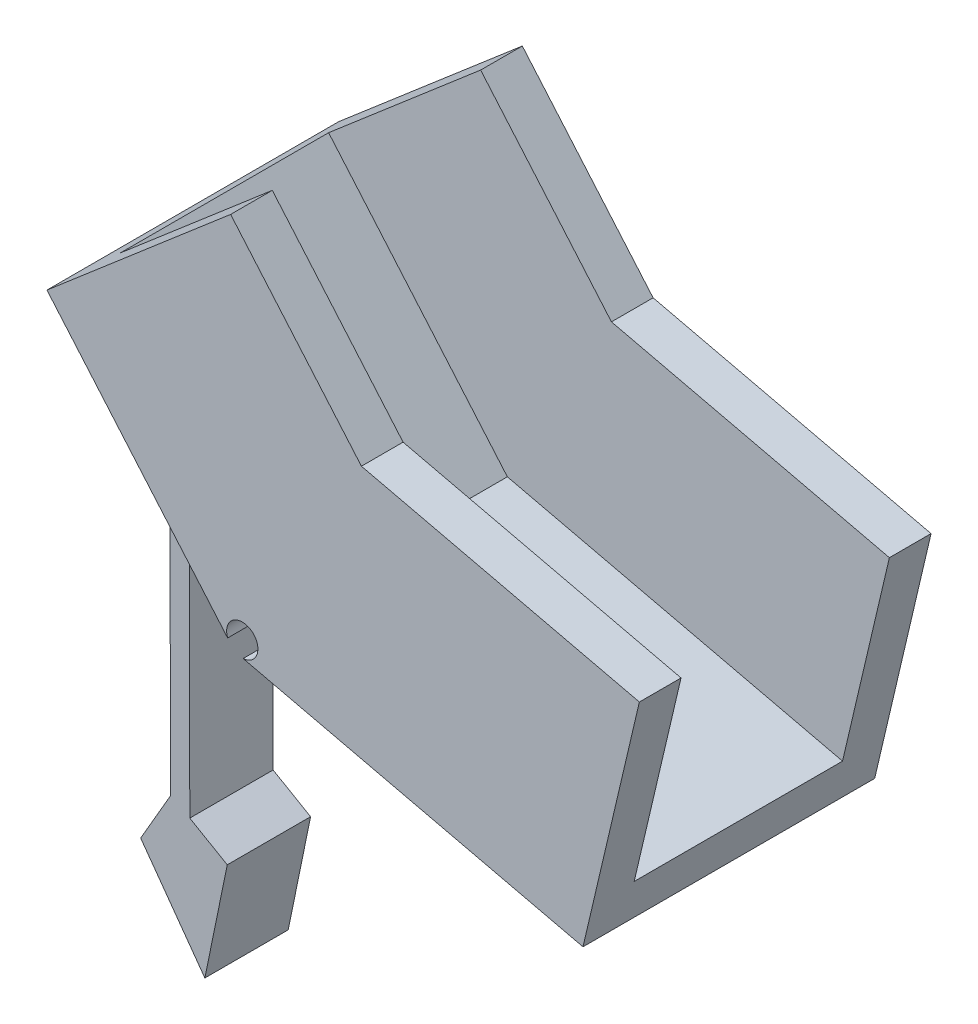
ISO-10303-21;
HEADER;
FILE_DESCRIPTION(('STEP AP214'),'2;1');
FILE_NAME('part.step','',(''),(''),'','','');
FILE_SCHEMA(('AUTOMOTIVE_DESIGN { 1 0 10303 214 1 1 1 1 }'));
ENDSEC;
DATA;
#1=APPLICATION_CONTEXT('core data for automotive mechanical design processes');
#2=APPLICATION_PROTOCOL_DEFINITION('international standard','automotive_design',2000,#1);
#3=PRODUCT_CONTEXT('',#1,'mechanical');
#4=PRODUCT('Part','Part','',(#3));
#5=PRODUCT_RELATED_PRODUCT_CATEGORY('part','',(#4));
#6=PRODUCT_DEFINITION_FORMATION('','',#4);
#7=PRODUCT_DEFINITION_CONTEXT('part definition',#1,'design');
#8=PRODUCT_DEFINITION('design','',#6,#7);
#9=PRODUCT_DEFINITION_SHAPE('','',#8);
#10=(LENGTH_UNIT() NAMED_UNIT(*) SI_UNIT(.MILLI.,.METRE.));
#11=(NAMED_UNIT(*) PLANE_ANGLE_UNIT() SI_UNIT($,.RADIAN.));
#12=(NAMED_UNIT(*) SI_UNIT($,.STERADIAN.) SOLID_ANGLE_UNIT());
#13=UNCERTAINTY_MEASURE_WITH_UNIT(LENGTH_MEASURE(1.E-05),#10,'distance_accuracy_value','');
#14=(GEOMETRIC_REPRESENTATION_CONTEXT(3) GLOBAL_UNCERTAINTY_ASSIGNED_CONTEXT((#13)) GLOBAL_UNIT_ASSIGNED_CONTEXT((#10,
#11,#12)) REPRESENTATION_CONTEXT('',''));
#15=CARTESIAN_POINT('',(0.,0.,0.));
#16=DIRECTION('',(0.,0.,1.));
#17=DIRECTION('',(1.,0.,0.));
#18=AXIS2_PLACEMENT_3D('',#15,#16,#17);
#19=CARTESIAN_POINT('',(28.5153445282735,6.50402219657851,10.));
#20=DIRECTION('',(0.228478349628428,0.973548994016773,0.));
#21=DIRECTION('',(-0.973548994016773,0.228478349628428,0.));
#22=AXIS2_PLACEMENT_3D('',#19,#20,#21);
#23=PLANE('',#22);
#24=DIRECTION('',(0.973548994016773,-0.228478349628428,0.));
#25=VECTOR('',#24,1.);
#26=CARTESIAN_POINT('',(28.5153445282735,6.50402219657851,12.));
#27=LINE('',#26,#25);
#28=CARTESIAN_POINT('',(28.9264850967183,6.40753324828637,12.));
#29=VERTEX_POINT('',#28);
#30=CARTESIAN_POINT('',(45.2385086558426,2.57932917761937,12.));
#31=VERTEX_POINT('',#30);
#32=EDGE_CURVE('E254',#29,#31,#27,.T.);
#33=ORIENTED_EDGE('',*,*,#32,.F.);
#34=DIRECTION('',(0.,0.,1.));
#35=VECTOR('',#34,1.);
#36=CARTESIAN_POINT('',(28.9264850967183,6.40753324828637,-2.));
#37=LINE('',#36,#35);
#38=CARTESIAN_POINT('',(28.9264850967182,6.40753324828637,-2.));
#39=VERTEX_POINT('',#38);
#40=EDGE_CURVE('E213',#29,#39,#37,.F.);
#41=ORIENTED_EDGE('',*,*,#40,.T.);
#42=DIRECTION('',(-0.973548994016773,0.228478349628428,0.));
#43=VECTOR('',#42,1.);
#44=CARTESIAN_POINT('',(-16.4748185209096,17.06258500766,-2.));
#45=LINE('',#44,#43);
#46=CARTESIAN_POINT('',(45.2385086558427,2.57932917761936,-2.));
#47=VERTEX_POINT('',#46);
#48=EDGE_CURVE('E224',#47,#39,#45,.T.);
#49=ORIENTED_EDGE('',*,*,#48,.F.);
#50=DIRECTION('',(0.,0.,-1.));
#51=VECTOR('',#50,1.);
#52=CARTESIAN_POINT('',(45.2385086558426,2.57932917761937,10.));
#53=LINE('',#52,#51);
#54=EDGE_CURVE('E42',#31,#47,#53,.T.);
#55=ORIENTED_EDGE('',*,*,#54,.F.);
#56=EDGE_LOOP('',(#33,#41,#49,#55));
#57=FACE_BOUND('',#56,.T.);
#58=ADVANCED_FACE('F35',(#57),#23,.F.);
#59=CARTESIAN_POINT('',(45.6954653550995,4.52642716565291,10.));
#60=DIRECTION('',(0.973548994016773,-0.228478349628428,0.));
#61=DIRECTION('',(0.228478349628428,0.973548994016773,0.));
#62=AXIS2_PLACEMENT_3D('',#59,#60,#61);
#63=PLANE('',#62);
#64=ORIENTED_EDGE('',*,*,#54,.T.);
#65=DIRECTION('',(-0.228478349628428,-0.973548994016773,0.));
#66=VECTOR('',#65,1.);
#67=CARTESIAN_POINT('',(40.3864879840851,-18.0951892247596,-2.));
#68=LINE('',#67,#66);
#69=CARTESIAN_POINT('',(47.9443348754312,14.1088872226101,-2.));
#70=VERTEX_POINT('',#69);
#71=EDGE_CURVE('E220',#70,#47,#68,.T.);
#72=ORIENTED_EDGE('',*,*,#71,.F.);
#73=DIRECTION('',(0.,0.,1.));
#74=VECTOR('',#73,1.);
#75=CARTESIAN_POINT('',(47.9443348754312,14.1088872226101,-2.));
#76=LINE('',#75,#74);
#77=CARTESIAN_POINT('',(47.9443348754312,14.1088872226101,0.));
#78=VERTEX_POINT('',#77);
#79=EDGE_CURVE('E247',#70,#78,#76,.T.);
#80=ORIENTED_EDGE('',*,*,#79,.T.);
#81=DIRECTION('',(-0.228478349628428,-0.973548994016773,0.));
#82=VECTOR('',#81,1.);
#83=CARTESIAN_POINT('',(40.3864879840851,-18.0951892247596,0.));
#84=LINE('',#83,#82);
#85=CARTESIAN_POINT('',(45.6954653550995,4.52642716565291,0.));
#86=VERTEX_POINT('',#85);
#87=EDGE_CURVE('E236',#78,#86,#84,.T.);
#88=ORIENTED_EDGE('',*,*,#87,.T.);
#89=DIRECTION('',(0.,0.,-1.));
#90=VECTOR('',#89,1.);
#91=CARTESIAN_POINT('',(45.6954653550995,4.52642716565291,10.));
#92=LINE('',#91,#90);
#93=CARTESIAN_POINT('',(45.6954653550995,4.52642716565291,10.));
#94=VERTEX_POINT('',#93);
#95=EDGE_CURVE('E301',#94,#86,#92,.T.);
#96=ORIENTED_EDGE('',*,*,#95,.F.);
#97=DIRECTION('',(0.228478349628428,0.973548994016773,0.));
#98=VECTOR('',#97,1.);
#99=CARTESIAN_POINT('',(47.9443348754312,14.1088872226101,10.));
#100=LINE('',#99,#98);
#101=CARTESIAN_POINT('',(47.9443348754312,14.1088872226101,10.));
#102=VERTEX_POINT('',#101);
#103=EDGE_CURVE('E250',#94,#102,#100,.T.);
#104=ORIENTED_EDGE('',*,*,#103,.T.);
#105=DIRECTION('',(0.,0.,-1.));
#106=VECTOR('',#105,1.);
#107=CARTESIAN_POINT('',(47.9443348754312,14.1088872226101,12.));
#108=LINE('',#107,#106);
#109=CARTESIAN_POINT('',(47.9443348754312,14.1088872226101,12.));
#110=VERTEX_POINT('',#109);
#111=EDGE_CURVE('E279',#110,#102,#108,.T.);
#112=ORIENTED_EDGE('',*,*,#111,.F.);
#113=DIRECTION('',(0.228478349628428,0.973548994016773,0.));
#114=VECTOR('',#113,1.);
#115=CARTESIAN_POINT('',(47.9443348754312,14.1088872226101,12.));
#116=LINE('',#115,#114);
#117=EDGE_CURVE('E257',#31,#110,#116,.T.);
#118=ORIENTED_EDGE('',*,*,#117,.F.);
#119=EDGE_LOOP('',(#64,#72,#80,#88,#96,#104,#112,#118));
#120=FACE_BOUND('',#119,.T.);
#121=ADVANCED_FACE('F305',(#120),#63,.T.);
#122=CARTESIAN_POINT('',(28.9723012275304,8.45112018461206,10.));
#123=DIRECTION('',(0.228478349628428,0.973548994016773,0.));
#124=DIRECTION('',(-0.973548994016773,0.228478349628428,0.));
#125=AXIS2_PLACEMENT_3D('',#122,#123,#124);
#126=PLANE('',#125);
#127=DIRECTION('',(0.973548994016773,-0.228478349628428,0.));
#128=VECTOR('',#127,1.);
#129=CARTESIAN_POINT('',(28.9723012275304,8.45112018461206,0.));
#130=LINE('',#129,#128);
#131=CARTESIAN_POINT('',(29.6087891147529,8.30174536842424,0.));
#132=VERTEX_POINT('',#131);
#133=EDGE_CURVE('E282',#132,#86,#130,.T.);
#134=ORIENTED_EDGE('',*,*,#133,.F.);
#135=DIRECTION('',(0.,0.,-1.));
#136=VECTOR('',#135,1.);
#137=CARTESIAN_POINT('',(29.6087891147529,8.30174536842424,10.));
#138=LINE('',#137,#136);
#139=CARTESIAN_POINT('',(29.6087891147529,8.30174536842424,10.));
#140=VERTEX_POINT('',#139);
#141=EDGE_CURVE('E299',#140,#132,#138,.T.);
#142=ORIENTED_EDGE('',*,*,#141,.F.);
#143=DIRECTION('',(0.973548994016773,-0.228478349628428,0.));
#144=VECTOR('',#143,1.);
#145=CARTESIAN_POINT('',(28.9723012275304,8.45112018461206,10.));
#146=LINE('',#145,#144);
#147=EDGE_CURVE('E283',#140,#94,#146,.T.);
#148=ORIENTED_EDGE('',*,*,#147,.T.);
#149=ORIENTED_EDGE('',*,*,#95,.T.);
#150=EDGE_LOOP('',(#134,#142,#148,#149));
#151=FACE_BOUND('',#150,.T.);
#152=ADVANCED_FACE('F345',(#151),#126,.T.);
#153=CARTESIAN_POINT('',(21.029242867494,18.3157968982283,10.));
#154=DIRECTION('',(0.759403711879393,0.650619706421347,0.));
#155=DIRECTION('',(-0.650619706421347,0.759403711879393,0.));
#156=AXIS2_PLACEMENT_3D('',#153,#154,#155);
#157=PLANE('',#156);
#158=DIRECTION('',(0.650619706421347,-0.759403711879393,0.));
#159=VECTOR('',#158,1.);
#160=CARTESIAN_POINT('',(21.029242867494,18.3157968982283,0.));
#161=LINE('',#160,#159);
#162=CARTESIAN_POINT('',(21.029242867494,18.3157968982283,0.));
#163=VERTEX_POINT('',#162);
#164=EDGE_CURVE('E287',#163,#132,#161,.T.);
#165=ORIENTED_EDGE('',*,*,#164,.F.);
#166=DIRECTION('',(0.,0.,-1.));
#167=VECTOR('',#166,1.);
#168=CARTESIAN_POINT('',(21.029242867494,18.3157968982283,10.));
#169=LINE('',#168,#167);
#170=CARTESIAN_POINT('',(21.029242867494,18.3157968982283,10.));
#171=VERTEX_POINT('',#170);
#172=EDGE_CURVE('E297',#171,#163,#169,.T.);
#173=ORIENTED_EDGE('',*,*,#172,.F.);
#174=DIRECTION('',(0.650619706421347,-0.759403711879393,0.));
#175=VECTOR('',#174,1.);
#176=CARTESIAN_POINT('',(21.029242867494,18.3157968982283,10.));
#177=LINE('',#176,#175);
#178=EDGE_CURVE('E286',#171,#140,#177,.T.);
#179=ORIENTED_EDGE('',*,*,#178,.T.);
#180=ORIENTED_EDGE('',*,*,#141,.T.);
#181=EDGE_LOOP('',(#165,#173,#179,#180));
#182=FACE_BOUND('',#181,.T.);
#183=ADVANCED_FACE('F361',(#182),#157,.T.);
#184=CARTESIAN_POINT('',(19.5104354437352,17.0145574853856,10.));
#185=DIRECTION('',(-0.650619706421346,0.759403711879394,0.));
#186=DIRECTION('',(-0.759403711879394,-0.650619706421346,0.));
#187=AXIS2_PLACEMENT_3D('',#184,#185,#186);
#188=PLANE('',#187);
#189=ORIENTED_EDGE('',*,*,#172,.T.);
#190=DIRECTION('',(0.759403711879393,0.650619706421347,0.));
#191=VECTOR('',#190,1.);
#192=CARTESIAN_POINT('',(-14.2313746257409,-11.893763896396,0.));
#193=LINE('',#192,#191);
#194=CARTESIAN_POINT('',(28.3260550401262,24.5673462642705,0.));
#195=VERTEX_POINT('',#194);
#196=EDGE_CURVE('E239',#163,#195,#193,.T.);
#197=ORIENTED_EDGE('',*,*,#196,.T.);
#198=DIRECTION('',(0.,0.,1.));
#199=VECTOR('',#198,1.);
#200=CARTESIAN_POINT('',(28.3260550401262,24.5673462642705,-2.));
#201=LINE('',#200,#199);
#202=CARTESIAN_POINT('',(28.3260550401262,24.5673462642705,-2.));
#203=VERTEX_POINT('',#202);
#204=EDGE_CURVE('E244',#203,#195,#201,.T.);
#205=ORIENTED_EDGE('',*,*,#204,.F.);
#206=DIRECTION('',(0.759403711879393,0.650619706421347,0.));
#207=VECTOR('',#206,1.);
#208=CARTESIAN_POINT('',(-14.2313746257409,-11.893763896396,-2.));
#209=LINE('',#208,#207);
#210=CARTESIAN_POINT('',(19.5104354437352,17.0145574853856,-2.));
#211=VERTEX_POINT('',#210);
#212=EDGE_CURVE('E229',#211,#203,#209,.T.);
#213=ORIENTED_EDGE('',*,*,#212,.F.);
#214=DIRECTION('',(0.,0.,-1.));
#215=VECTOR('',#214,1.);
#216=CARTESIAN_POINT('',(19.5104354437352,17.0145574853856,10.));
#217=LINE('',#216,#215);
#218=CARTESIAN_POINT('',(19.5104354437352,17.0145574853856,12.));
#219=VERTEX_POINT('',#218);
#220=EDGE_CURVE('E290',#219,#211,#217,.T.);
#221=ORIENTED_EDGE('',*,*,#220,.F.);
#222=DIRECTION('',(-0.759403711879393,-0.650619706421347,0.));
#223=VECTOR('',#222,1.);
#224=CARTESIAN_POINT('',(19.5104354437352,17.0145574853856,12.));
#225=LINE('',#224,#223);
#226=CARTESIAN_POINT('',(28.3260550401262,24.5673462642705,12.));
#227=VERTEX_POINT('',#226);
#228=EDGE_CURVE('E263',#227,#219,#225,.T.);
#229=ORIENTED_EDGE('',*,*,#228,.F.);
#230=DIRECTION('',(0.,0.,-1.));
#231=VECTOR('',#230,1.);
#232=CARTESIAN_POINT('',(28.3260550401262,24.5673462642705,12.));
#233=LINE('',#232,#231);
#234=CARTESIAN_POINT('',(28.3260550401262,24.5673462642705,10.));
#235=VERTEX_POINT('',#234);
#236=EDGE_CURVE('E266',#227,#235,#233,.T.);
#237=ORIENTED_EDGE('',*,*,#236,.T.);
#238=DIRECTION('',(-0.759403711879393,-0.650619706421347,0.));
#239=VECTOR('',#238,1.);
#240=CARTESIAN_POINT('',(19.5104354437352,17.0145574853856,10.));
#241=LINE('',#240,#239);
#242=EDGE_CURVE('E255',#235,#171,#241,.T.);
#243=ORIENTED_EDGE('',*,*,#242,.T.);
#244=EDGE_LOOP('',(#189,#197,#205,#213,#221,#229,#237,#243));
#245=FACE_BOUND('',#244,.T.);
#246=ADVANCED_FACE('F330',(#245),#188,.T.);
#247=CARTESIAN_POINT('',(19.5104354437352,17.0145574853856,10.));
#248=DIRECTION('',(0.759403711879393,0.650619706421347,0.));
#249=DIRECTION('',(-0.650619706421347,0.759403711879393,0.));
#250=AXIS2_PLACEMENT_3D('',#247,#248,#249);
#251=PLANE('',#250);
#252=DIRECTION('',(0.,0.,-1.));
#253=VECTOR('',#252,1.);
#254=CARTESIAN_POINT('',(25.4476892611492,10.0845912657728,8.));
#255=LINE('',#254,#253);
#256=CARTESIAN_POINT('',(25.4476892611492,10.0845912657728,8.));
#257=VERTEX_POINT('',#256);
#258=CARTESIAN_POINT('',(25.4476892611492,10.0845912657728,4.));
#259=VERTEX_POINT('',#258);
#260=EDGE_CURVE('E54',#257,#259,#255,.T.);
#261=ORIENTED_EDGE('',*,*,#260,.F.);
#262=DIRECTION('',(0.650619706421347,-0.759403711879393,0.));
#263=VECTOR('',#262,1.);
#264=CARTESIAN_POINT('',(19.6581549589548,16.8421391785504,8.));
#265=LINE('',#264,#263);
#266=CARTESIAN_POINT('',(26.3792351296592,8.99729036887335,8.));
#267=VERTEX_POINT('',#266);
#268=EDGE_CURVE('E49',#257,#267,#265,.T.);
#269=ORIENTED_EDGE('',*,*,#268,.T.);
#270=DIRECTION('',(0.,0.,-1.));
#271=VECTOR('',#270,1.);
#272=CARTESIAN_POINT('',(26.3792351296592,8.99729036887336,8.));
#273=LINE('',#272,#271);
#274=CARTESIAN_POINT('',(26.3792351296592,8.99729036887336,4.));
#275=VERTEX_POINT('',#274);
#276=EDGE_CURVE('E188',#267,#275,#273,.T.);
#277=ORIENTED_EDGE('',*,*,#276,.T.);
#278=DIRECTION('',(0.650619706421347,-0.759403711879393,0.));
#279=VECTOR('',#278,1.);
#280=CARTESIAN_POINT('',(19.6581549589548,16.8421391785504,4.));
#281=LINE('',#280,#279);
#282=EDGE_CURVE('E607',#259,#275,#281,.T.);
#283=ORIENTED_EDGE('',*,*,#282,.F.);
#284=EDGE_LOOP('',(#261,#269,#277,#283));
#285=FACE_BOUND('',#284,.T.);
#286=DIRECTION('',(-0.650619706421347,0.759403711879393,0.));
#287=VECTOR('',#286,1.);
#288=CARTESIAN_POINT('',(12.414970876809,25.2963879870626,-2.));
#289=LINE('',#288,#287);
#290=CARTESIAN_POINT('',(28.1839273805532,6.89085249033582,-2.));
#291=VERTEX_POINT('',#290);
#292=EDGE_CURVE('E227',#291,#211,#289,.T.);
#293=ORIENTED_EDGE('',*,*,#292,.F.);
#294=DIRECTION('',(0.,0.,1.));
#295=VECTOR('',#294,1.);
#296=CARTESIAN_POINT('',(28.1839273805532,6.8908524903358,-2.));
#297=LINE('',#296,#295);
#298=CARTESIAN_POINT('',(28.1839273805532,6.89085249033581,12.));
#299=VERTEX_POINT('',#298);
#300=EDGE_CURVE('E206',#291,#299,#297,.T.);
#301=ORIENTED_EDGE('',*,*,#300,.T.);
#302=DIRECTION('',(0.650619706421347,-0.759403711879393,0.));
#303=VECTOR('',#302,1.);
#304=CARTESIAN_POINT('',(19.5104354437352,17.0145574853856,12.));
#305=LINE('',#304,#303);
#306=EDGE_CURVE('E251',#219,#299,#305,.T.);
#307=ORIENTED_EDGE('',*,*,#306,.F.);
#308=ORIENTED_EDGE('',*,*,#220,.T.);
#309=EDGE_LOOP('',(#293,#301,#307,#308));
#310=FACE_BOUND('',#309,.T.);
#311=ADVANCED_FACE('F324',(#285,#310),#251,.F.);
#312=CARTESIAN_POINT('',(34.6040511184167,17.2396654732269,12.));
#313=DIRECTION('',(-0.228478349628428,-0.973548994016773,0.));
#314=DIRECTION('',(0.973548994016773,-0.228478349628428,0.));
#315=AXIS2_PLACEMENT_3D('',#312,#313,#314);
#316=PLANE('',#315);
#317=DIRECTION('',(-0.973548994016772,0.228478349628428,0.));
#318=VECTOR('',#317,1.);
#319=CARTESIAN_POINT('',(34.6040511184167,17.2396654732269,10.));
#320=LINE('',#319,#318);
#321=CARTESIAN_POINT('',(34.6040511184167,17.2396654732269,10.));
#322=VERTEX_POINT('',#321);
#323=EDGE_CURVE('E268',#102,#322,#320,.T.);
#324=ORIENTED_EDGE('',*,*,#323,.T.);
#325=DIRECTION('',(0.,0.,-1.));
#326=VECTOR('',#325,1.);
#327=CARTESIAN_POINT('',(34.6040511184167,17.2396654732269,12.));
#328=LINE('',#327,#326);
#329=CARTESIAN_POINT('',(34.6040511184167,17.2396654732269,12.));
#330=VERTEX_POINT('',#329);
#331=EDGE_CURVE('E276',#330,#322,#328,.T.);
#332=ORIENTED_EDGE('',*,*,#331,.F.);
#333=DIRECTION('',(-0.973548994016772,0.228478349628428,0.));
#334=VECTOR('',#333,1.);
#335=CARTESIAN_POINT('',(34.6040511184167,17.2396654732269,12.));
#336=LINE('',#335,#334);
#337=EDGE_CURVE('E259',#110,#330,#336,.T.);
#338=ORIENTED_EDGE('',*,*,#337,.F.);
#339=ORIENTED_EDGE('',*,*,#111,.T.);
#340=EDGE_LOOP('',(#324,#332,#338,#339));
#341=FACE_BOUND('',#340,.T.);
#342=ADVANCED_FACE('F353',(#341),#316,.F.);
#343=CARTESIAN_POINT('',(28.3260550401262,24.5673462642705,12.));
#344=DIRECTION('',(-0.759403711879392,-0.650619706421348,0.));
#345=DIRECTION('',(0.650619706421348,-0.759403711879392,0.));
#346=AXIS2_PLACEMENT_3D('',#343,#344,#345);
#347=PLANE('',#346);
#348=DIRECTION('',(-0.650619706421348,0.759403711879392,0.));
#349=VECTOR('',#348,1.);
#350=CARTESIAN_POINT('',(28.3260550401262,24.5673462642705,10.));
#351=LINE('',#350,#349);
#352=EDGE_CURVE('E270',#322,#235,#351,.T.);
#353=ORIENTED_EDGE('',*,*,#352,.T.);
#354=ORIENTED_EDGE('',*,*,#236,.F.);
#355=DIRECTION('',(-0.650619706421348,0.759403711879392,0.));
#356=VECTOR('',#355,1.);
#357=CARTESIAN_POINT('',(28.3260550401262,24.5673462642705,12.));
#358=LINE('',#357,#356);
#359=EDGE_CURVE('E261',#330,#227,#358,.T.);
#360=ORIENTED_EDGE('',*,*,#359,.F.);
#361=ORIENTED_EDGE('',*,*,#331,.T.);
#362=EDGE_LOOP('',(#353,#354,#360,#361));
#363=FACE_BOUND('',#362,.T.);
#364=ADVANCED_FACE('F358',(#363),#347,.F.);
#365=CARTESIAN_POINT('',(0.,0.,12.));
#366=DIRECTION('',(0.,0.,1.));
#367=DIRECTION('',(1.,0.,0.));
#368=AXIS2_PLACEMENT_3D('',#365,#366,#367);
#369=PLANE('',#368);
#370=CARTESIAN_POINT('',(28.8853419881829,7.15640389440628,12.));
#371=DIRECTION('',(0.,0.,1.));
#372=DIRECTION('',(1.,0.,0.));
#373=AXIS2_PLACEMENT_3D('',#370,#371,#372);
#374=CIRCLE('',#373,0.749999999999998);
#375=EDGE_CURVE('E204',#29,#299,#374,.T.);
#376=ORIENTED_EDGE('',*,*,#375,.F.);
#377=ORIENTED_EDGE('',*,*,#32,.T.);
#378=ORIENTED_EDGE('',*,*,#117,.T.);
#379=ORIENTED_EDGE('',*,*,#337,.T.);
#380=ORIENTED_EDGE('',*,*,#359,.T.);
#381=ORIENTED_EDGE('',*,*,#228,.T.);
#382=ORIENTED_EDGE('',*,*,#306,.T.);
#383=EDGE_LOOP('',(#376,#377,#378,#379,#380,#381,#382));
#384=FACE_BOUND('',#383,.T.);
#385=ADVANCED_FACE('F319',(#384),#369,.T.);
#386=CARTESIAN_POINT('',(0.,0.,10.));
#387=DIRECTION('',(0.,0.,1.));
#388=DIRECTION('',(1.,0.,0.));
#389=AXIS2_PLACEMENT_3D('',#386,#387,#388);
#390=PLANE('',#389);
#391=ORIENTED_EDGE('',*,*,#147,.F.);
#392=ORIENTED_EDGE('',*,*,#178,.F.);
#393=ORIENTED_EDGE('',*,*,#242,.F.);
#394=ORIENTED_EDGE('',*,*,#352,.F.);
#395=ORIENTED_EDGE('',*,*,#323,.F.);
#396=ORIENTED_EDGE('',*,*,#103,.F.);
#397=EDGE_LOOP('',(#391,#392,#393,#394,#395,#396));
#398=FACE_BOUND('',#397,.T.);
#399=ADVANCED_FACE('F347',(#398),#390,.F.);
#400=CARTESIAN_POINT('',(0.,0.,0.));
#401=DIRECTION('',(0.,0.,-1.));
#402=DIRECTION('',(-1.,0.,0.));
#403=AXIS2_PLACEMENT_3D('',#400,#401,#402);
#404=PLANE('',#403);
#405=ORIENTED_EDGE('',*,*,#196,.F.);
#406=ORIENTED_EDGE('',*,*,#164,.T.);
#407=ORIENTED_EDGE('',*,*,#133,.T.);
#408=ORIENTED_EDGE('',*,*,#87,.F.);
#409=DIRECTION('',(0.973548994016773,-0.228478349628428,0.));
#410=VECTOR('',#409,1.);
#411=CARTESIAN_POINT('',(-13.768992301321,28.5921430526507,0.));
#412=LINE('',#411,#410);
#413=CARTESIAN_POINT('',(34.6040511184167,17.239665473227,0.));
#414=VERTEX_POINT('',#413);
#415=EDGE_CURVE('E216',#414,#78,#412,.T.);
#416=ORIENTED_EDGE('',*,*,#415,.F.);
#417=DIRECTION('',(0.650619706421348,-0.759403711879392,0.));
#418=VECTOR('',#417,1.);
#419=CARTESIAN_POINT('',(21.2305904731999,32.8491767659475,0.));
#420=LINE('',#419,#418);
#421=EDGE_CURVE('E221',#195,#414,#420,.T.);
#422=ORIENTED_EDGE('',*,*,#421,.F.);
#423=EDGE_LOOP('',(#405,#406,#407,#408,#416,#422));
#424=FACE_BOUND('',#423,.T.);
#425=ADVANCED_FACE('F340',(#424),#404,.F.);
#426=CARTESIAN_POINT('',(-13.768992301321,28.5921430526507,-2.));
#427=DIRECTION('',(-0.228478349628428,-0.973548994016773,0.));
#428=DIRECTION('',(0.973548994016773,-0.228478349628428,0.));
#429=AXIS2_PLACEMENT_3D('',#426,#427,#428);
#430=PLANE('',#429);
#431=ORIENTED_EDGE('',*,*,#415,.T.);
#432=ORIENTED_EDGE('',*,*,#79,.F.);
#433=DIRECTION('',(0.973548994016773,-0.228478349628428,0.));
#434=VECTOR('',#433,1.);
#435=CARTESIAN_POINT('',(-13.768992301321,28.5921430526507,-2.));
#436=LINE('',#435,#434);
#437=CARTESIAN_POINT('',(34.6040511184167,17.239665473227,-2.));
#438=VERTEX_POINT('',#437);
#439=EDGE_CURVE('E217',#438,#70,#436,.T.);
#440=ORIENTED_EDGE('',*,*,#439,.F.);
#441=DIRECTION('',(0.,0.,1.));
#442=VECTOR('',#441,1.);
#443=CARTESIAN_POINT('',(34.6040511184167,17.239665473227,-2.));
#444=LINE('',#443,#442);
#445=EDGE_CURVE('E233',#438,#414,#444,.T.);
#446=ORIENTED_EDGE('',*,*,#445,.T.);
#447=EDGE_LOOP('',(#431,#432,#440,#446));
#448=FACE_BOUND('',#447,.T.);
#449=ADVANCED_FACE('F337',(#448),#430,.F.);
#450=CARTESIAN_POINT('',(21.2305904731999,32.8491767659475,-2.));
#451=DIRECTION('',(-0.759403711879392,-0.650619706421348,0.));
#452=DIRECTION('',(0.650619706421348,-0.759403711879392,0.));
#453=AXIS2_PLACEMENT_3D('',#450,#451,#452);
#454=PLANE('',#453);
#455=ORIENTED_EDGE('',*,*,#421,.T.);
#456=ORIENTED_EDGE('',*,*,#445,.F.);
#457=DIRECTION('',(0.650619706421348,-0.759403711879392,0.));
#458=VECTOR('',#457,1.);
#459=CARTESIAN_POINT('',(21.2305904731999,32.8491767659475,-2.));
#460=LINE('',#459,#458);
#461=EDGE_CURVE('E231',#203,#438,#460,.T.);
#462=ORIENTED_EDGE('',*,*,#461,.F.);
#463=ORIENTED_EDGE('',*,*,#204,.T.);
#464=EDGE_LOOP('',(#455,#456,#462,#463));
#465=FACE_BOUND('',#464,.T.);
#466=ADVANCED_FACE('F334',(#465),#454,.F.);
#467=CARTESIAN_POINT('',(0.,0.,-2.));
#468=DIRECTION('',(0.,0.,-1.));
#469=DIRECTION('',(-1.,0.,0.));
#470=AXIS2_PLACEMENT_3D('',#467,#468,#469);
#471=PLANE('',#470);
#472=CARTESIAN_POINT('',(28.8853419881829,7.15640389440628,-2.));
#473=DIRECTION('',(0.,0.,-1.));
#474=DIRECTION('',(-1.,0.,0.));
#475=AXIS2_PLACEMENT_3D('',#472,#473,#474);
#476=CIRCLE('',#475,0.749999999999998);
#477=EDGE_CURVE('E11',#291,#39,#476,.T.);
#478=ORIENTED_EDGE('',*,*,#477,.F.);
#479=ORIENTED_EDGE('',*,*,#292,.T.);
#480=ORIENTED_EDGE('',*,*,#212,.T.);
#481=ORIENTED_EDGE('',*,*,#461,.T.);
#482=ORIENTED_EDGE('',*,*,#439,.T.);
#483=ORIENTED_EDGE('',*,*,#71,.T.);
#484=ORIENTED_EDGE('',*,*,#48,.T.);
#485=EDGE_LOOP('',(#478,#479,#480,#481,#482,#483,#484));
#486=FACE_BOUND('',#485,.T.);
#487=ADVANCED_FACE('F312',(#486),#471,.T.);
#488=CARTESIAN_POINT('',(28.8853419881829,7.15640389440628,-2.));
#489=DIRECTION('',(0.,0.,1.));
#490=DIRECTION('',(1.,0.,0.));
#491=AXIS2_PLACEMENT_3D('',#488,#489,#490);
#492=CYLINDRICAL_SURFACE('',#491,0.749999999999998);
#493=ORIENTED_EDGE('',*,*,#375,.T.);
#494=ORIENTED_EDGE('',*,*,#300,.F.);
#495=ORIENTED_EDGE('',*,*,#477,.T.);
#496=ORIENTED_EDGE('',*,*,#40,.F.);
#497=EDGE_LOOP('',(#493,#494,#495,#496));
#498=FACE_BOUND('',#497,.T.);
#499=ADVANCED_FACE('F317',(#498),#492,.F.);
#500=CARTESIAN_POINT('',(22.3602788674752,0.0218340202512122,8.));
#501=DIRECTION('',(-0.999999523258806,-0.00097646411171529,0.));
#502=DIRECTION('',(0.00097646411171529,-0.999999523258806,0.));
#503=AXIS2_PLACEMENT_3D('',#500,#501,#502);
#504=PLANE('',#503);
#505=DIRECTION('',(-0.00097646411171529,0.999999523258806,0.));
#506=VECTOR('',#505,1.);
#507=CARTESIAN_POINT('',(22.3602788674752,0.0218340202512122,4.));
#508=LINE('',#507,#506);
#509=CARTESIAN_POINT('',(22.3656768053961,-5.50620872373804,4.));
#510=VERTEX_POINT('',#509);
#511=CARTESIAN_POINT('',(22.3548813733866,5.54942223433152,4.));
#512=VERTEX_POINT('',#511);
#513=EDGE_CURVE('E203',#510,#512,#508,.T.);
#514=ORIENTED_EDGE('',*,*,#513,.T.);
#515=DIRECTION('',(0.,0.,-1.));
#516=VECTOR('',#515,1.);
#517=CARTESIAN_POINT('',(22.3548813733866,5.54942223433152,8.));
#518=LINE('',#517,#516);
#519=CARTESIAN_POINT('',(22.3548813733866,5.54942223433152,8.));
#520=VERTEX_POINT('',#519);
#521=EDGE_CURVE('E186',#520,#512,#518,.T.);
#522=ORIENTED_EDGE('',*,*,#521,.F.);
#523=DIRECTION('',(-0.00097646411171529,0.999999523258806,0.));
#524=VECTOR('',#523,1.);
#525=CARTESIAN_POINT('',(22.3602788674752,0.0218340202512122,8.));
#526=LINE('',#525,#524);
#527=CARTESIAN_POINT('',(22.3656768053961,-5.50620872373804,8.));
#528=VERTEX_POINT('',#527);
#529=EDGE_CURVE('E190',#528,#520,#526,.T.);
#530=ORIENTED_EDGE('',*,*,#529,.F.);
#531=DIRECTION('',(0.,0.,-1.));
#532=VECTOR('',#531,1.);
#533=CARTESIAN_POINT('',(22.3656768053961,-5.50620872373804,8.));
#534=LINE('',#533,#532);
#535=EDGE_CURVE('E624',#528,#510,#534,.T.);
#536=ORIENTED_EDGE('',*,*,#535,.T.);
#537=EDGE_LOOP('',(#514,#522,#530,#536));
#538=FACE_BOUND('',#537,.T.);
#539=ADVANCED_FACE('F201',(#538),#504,.F.);
#540=CARTESIAN_POINT('',(6.72108017070441,-7.84484880967702,8.));
#541=DIRECTION('',(-0.650619706421347,0.759403711879393,0.));
#542=DIRECTION('',(-0.759403711879393,-0.650619706421347,0.));
#543=AXIS2_PLACEMENT_3D('',#540,#541,#542);
#544=PLANE('',#543);
#545=DIRECTION('',(0.759403711879393,0.650619706421347,0.));
#546=VECTOR('',#545,1.);
#547=CARTESIAN_POINT('',(6.72108017070441,-7.84484880967702,4.));
#548=LINE('',#547,#546);
#549=EDGE_CURVE('E605',#512,#275,#548,.T.);
#550=ORIENTED_EDGE('',*,*,#549,.T.);
#551=ORIENTED_EDGE('',*,*,#276,.F.);
#552=DIRECTION('',(0.759403711879393,0.650619706421347,0.));
#553=VECTOR('',#552,1.);
#554=CARTESIAN_POINT('',(6.72108017070441,-7.84484880967702,8.));
#555=LINE('',#554,#553);
#556=EDGE_CURVE('E181',#520,#267,#555,.T.);
#557=ORIENTED_EDGE('',*,*,#556,.F.);
#558=ORIENTED_EDGE('',*,*,#521,.T.);
#559=EDGE_LOOP('',(#550,#551,#557,#558));
#560=FACE_BOUND('',#559,.T.);
#561=ADVANCED_FACE('F184',(#560),#544,.F.);
#562=CARTESIAN_POINT('',(5.78953430219444,-6.75754791277757,8.));
#563=DIRECTION('',(0.650619706421347,-0.759403711879393,0.));
#564=DIRECTION('',(0.759403711879393,0.650619706421347,0.));
#565=AXIS2_PLACEMENT_3D('',#562,#563,#564);
#566=PLANE('',#565);
#567=DIRECTION('',(-0.759403711879393,-0.650619706421347,0.));
#568=VECTOR('',#567,1.);
#569=CARTESIAN_POINT('',(5.78953430219444,-6.75754791277757,4.));
#570=LINE('',#569,#568);
#571=CARTESIAN_POINT('',(21.4233355048766,6.63672313123097,4.));
#572=VERTEX_POINT('',#571);
#573=EDGE_CURVE('E613',#259,#572,#570,.T.);
#574=ORIENTED_EDGE('',*,*,#573,.T.);
#575=DIRECTION('',(0.,0.,-1.));
#576=VECTOR('',#575,1.);
#577=CARTESIAN_POINT('',(21.4233355048766,6.63672313123097,8.));
#578=LINE('',#577,#576);
#579=CARTESIAN_POINT('',(21.4233355048766,6.63672313123097,8.));
#580=VERTEX_POINT('',#579);
#581=EDGE_CURVE('E638',#580,#572,#578,.T.);
#582=ORIENTED_EDGE('',*,*,#581,.F.);
#583=DIRECTION('',(-0.759403711879393,-0.650619706421347,0.));
#584=VECTOR('',#583,1.);
#585=CARTESIAN_POINT('',(5.78953430219444,-6.75754791277757,8.));
#586=LINE('',#585,#584);
#587=EDGE_CURVE('E642',#257,#580,#586,.T.);
#588=ORIENTED_EDGE('',*,*,#587,.F.);
#589=ORIENTED_EDGE('',*,*,#260,.T.);
#590=EDGE_LOOP('',(#574,#582,#588,#589));
#591=FACE_BOUND('',#590,.T.);
#592=ADVANCED_FACE('F478',(#591),#566,.F.);
#593=CARTESIAN_POINT('',(21.4297955969758,0.020925436297853,8.));
#594=DIRECTION('',(0.999999523258806,0.000976464111715024,0.));
#595=DIRECTION('',(-0.000976464111715024,0.999999523258806,0.));
#596=AXIS2_PLACEMENT_3D('',#593,#594,#595);
#597=PLANE('',#596);
#598=DIRECTION('',(0.000976464111715024,-0.999999523258806,0.));
#599=VECTOR('',#598,1.);
#600=CARTESIAN_POINT('',(21.4297955969758,0.020925436297853,4.));
#601=LINE('',#600,#599);
#602=CARTESIAN_POINT('',(21.434748511942,-5.05136810272655,4.));
#603=VERTEX_POINT('',#602);
#604=EDGE_CURVE('E615',#572,#603,#601,.T.);
#605=ORIENTED_EDGE('',*,*,#604,.T.);
#606=DIRECTION('',(0.,0.,-1.));
#607=VECTOR('',#606,1.);
#608=CARTESIAN_POINT('',(21.434748511942,-5.05136810272655,8.));
#609=LINE('',#608,#607);
#610=CARTESIAN_POINT('',(21.434748511942,-5.05136810272655,8.));
#611=VERTEX_POINT('',#610);
#612=EDGE_CURVE('E635',#611,#603,#609,.T.);
#613=ORIENTED_EDGE('',*,*,#612,.F.);
#614=DIRECTION('',(0.000976464111715024,-0.999999523258806,0.));
#615=VECTOR('',#614,1.);
#616=CARTESIAN_POINT('',(21.4297955969758,0.020925436297853,8.));
#617=LINE('',#616,#615);
#618=EDGE_CURVE('E653',#580,#611,#617,.T.);
#619=ORIENTED_EDGE('',*,*,#618,.F.);
#620=ORIENTED_EDGE('',*,*,#581,.T.);
#621=EDGE_LOOP('',(#605,#613,#619,#620));
#622=FACE_BOUND('',#621,.T.);
#623=ADVANCED_FACE('F487',(#622),#597,.F.);
#624=CARTESIAN_POINT('',(18.2413259793342,-10.5650460493306,8.));
#625=DIRECTION('',(0.865338267036984,-0.501188271612005,0.));
#626=DIRECTION('',(0.501188271612005,0.865338267036984,0.));
#627=AXIS2_PLACEMENT_3D('',#624,#625,#626);
#628=PLANE('',#627);
#629=DIRECTION('',(-0.501188271612005,-0.865338267036984,0.));
#630=VECTOR('',#629,1.);
#631=CARTESIAN_POINT('',(18.2413259793342,-10.5650460493306,4.));
#632=LINE('',#631,#630);
#633=CARTESIAN_POINT('',(20.0087302235056,-7.51349314509775,4.));
#634=VERTEX_POINT('',#633);
#635=EDGE_CURVE('E617',#603,#634,#632,.T.);
#636=ORIENTED_EDGE('',*,*,#635,.T.);
#637=DIRECTION('',(0.,0.,-1.));
#638=VECTOR('',#637,1.);
#639=CARTESIAN_POINT('',(20.0087302235056,-7.51349314509775,8.));
#640=LINE('',#639,#638);
#641=CARTESIAN_POINT('',(20.0087302235056,-7.51349314509775,8.));
#642=VERTEX_POINT('',#641);
#643=EDGE_CURVE('E632',#642,#634,#640,.T.);
#644=ORIENTED_EDGE('',*,*,#643,.F.);
#645=DIRECTION('',(-0.501188271612005,-0.865338267036984,0.));
#646=VECTOR('',#645,1.);
#647=CARTESIAN_POINT('',(18.2413259793342,-10.5650460493306,8.));
#648=LINE('',#647,#646);
#649=EDGE_CURVE('E650',#611,#642,#648,.T.);
#650=ORIENTED_EDGE('',*,*,#649,.F.);
#651=ORIENTED_EDGE('',*,*,#612,.T.);
#652=EDGE_LOOP('',(#636,#644,#650,#651));
#653=FACE_BOUND('',#652,.T.);
#654=ADVANCED_FACE('F497',(#653),#628,.F.);
#655=CARTESIAN_POINT('',(9.60851890398921,6.92238128881758,8.));
#656=DIRECTION('',(0.811364225488095,0.584540925511725,0.));
#657=DIRECTION('',(-0.584540925511725,0.811364225488095,0.));
#658=AXIS2_PLACEMENT_3D('',#655,#656,#657);
#659=PLANE('',#658);
#660=DIRECTION('',(0.584540925511725,-0.811364225488095,0.));
#661=VECTOR('',#660,1.);
#662=CARTESIAN_POINT('',(9.60851890398921,6.92238128881758,4.));
#663=LINE('',#662,#661);
#664=CARTESIAN_POINT('',(23.0898673305782,-11.7902243599636,4.));
#665=VERTEX_POINT('',#664);
#666=EDGE_CURVE('E619',#634,#665,#663,.T.);
#667=ORIENTED_EDGE('',*,*,#666,.T.);
#668=DIRECTION('',(0.,0.,-1.));
#669=VECTOR('',#668,1.);
#670=CARTESIAN_POINT('',(23.0898673305782,-11.7902243599636,8.));
#671=LINE('',#670,#669);
#672=CARTESIAN_POINT('',(23.0898673305782,-11.7902243599636,8.));
#673=VERTEX_POINT('',#672);
#674=EDGE_CURVE('E629',#673,#665,#671,.T.);
#675=ORIENTED_EDGE('',*,*,#674,.F.);
#676=DIRECTION('',(0.584540925511725,-0.811364225488095,0.));
#677=VECTOR('',#676,1.);
#678=CARTESIAN_POINT('',(9.60851890398921,6.92238128881758,8.));
#679=LINE('',#678,#677);
#680=EDGE_CURVE('E652',#642,#673,#679,.T.);
#681=ORIENTED_EDGE('',*,*,#680,.F.);
#682=ORIENTED_EDGE('',*,*,#643,.T.);
#683=EDGE_LOOP('',(#667,#675,#681,#682));
#684=FACE_BOUND('',#683,.T.);
#685=ADVANCED_FACE('F507',(#684),#659,.F.);
#686=CARTESIAN_POINT('',(24.4781549086397,-5.01782703760302,8.));
#687=DIRECTION('',(-0.97962894874242,0.20081614174618,0.));
#688=DIRECTION('',(-0.20081614174618,-0.97962894874242,0.));
#689=AXIS2_PLACEMENT_3D('',#686,#687,#688);
#690=PLANE('',#689);
#691=DIRECTION('',(0.20081614174618,0.97962894874242,0.));
#692=VECTOR('',#691,1.);
#693=CARTESIAN_POINT('',(24.4781549086397,-5.01782703760302,4.));
#694=LINE('',#693,#692);
#695=CARTESIAN_POINT('',(24.1644735727268,-6.54803927387272,4.));
#696=VERTEX_POINT('',#695);
#697=EDGE_CURVE('E621',#665,#696,#694,.T.);
#698=ORIENTED_EDGE('',*,*,#697,.T.);
#699=DIRECTION('',(0.,0.,-1.));
#700=VECTOR('',#699,1.);
#701=CARTESIAN_POINT('',(24.1644735727268,-6.54803927387272,8.));
#702=LINE('',#701,#700);
#703=CARTESIAN_POINT('',(24.1644735727268,-6.54803927387272,8.));
#704=VERTEX_POINT('',#703);
#705=EDGE_CURVE('E626',#704,#696,#702,.T.);
#706=ORIENTED_EDGE('',*,*,#705,.F.);
#707=DIRECTION('',(0.20081614174618,0.97962894874242,0.));
#708=VECTOR('',#707,1.);
#709=CARTESIAN_POINT('',(24.4781549086397,-5.01782703760302,8.));
#710=LINE('',#709,#708);
#711=EDGE_CURVE('E655',#673,#704,#710,.T.);
#712=ORIENTED_EDGE('',*,*,#711,.F.);
#713=ORIENTED_EDGE('',*,*,#674,.T.);
#714=EDGE_LOOP('',(#698,#706,#712,#713));
#715=FACE_BOUND('',#714,.T.);
#716=ADVANCED_FACE('F517',(#715),#690,.F.);
#717=CARTESIAN_POINT('',(3.2299989257083,5.57682976880896,8.));
#718=DIRECTION('',(-0.501188271612005,-0.865338267036984,0.));
#719=DIRECTION('',(0.865338267036984,-0.501188271612005,0.));
#720=AXIS2_PLACEMENT_3D('',#717,#718,#719);
#721=PLANE('',#720);
#722=DIRECTION('',(-0.865338267036984,0.501188271612005,0.));
#723=VECTOR('',#722,1.);
#724=CARTESIAN_POINT('',(3.2299989257083,5.57682976880896,4.));
#725=LINE('',#724,#723);
#726=EDGE_CURVE('E199',#696,#510,#725,.T.);
#727=ORIENTED_EDGE('',*,*,#726,.T.);
#728=ORIENTED_EDGE('',*,*,#535,.F.);
#729=DIRECTION('',(-0.865338267036984,0.501188271612005,0.));
#730=VECTOR('',#729,1.);
#731=CARTESIAN_POINT('',(3.2299989257083,5.57682976880896,8.));
#732=LINE('',#731,#730);
#733=EDGE_CURVE('E195',#704,#528,#732,.T.);
#734=ORIENTED_EDGE('',*,*,#733,.F.);
#735=ORIENTED_EDGE('',*,*,#705,.T.);
#736=EDGE_LOOP('',(#727,#728,#734,#735));
#737=FACE_BOUND('',#736,.T.);
#738=ADVANCED_FACE('F527',(#737),#721,.F.);
#739=CARTESIAN_POINT('',(0.,0.,8.));
#740=DIRECTION('',(0.,0.,1.));
#741=DIRECTION('',(1.,0.,0.));
#742=AXIS2_PLACEMENT_3D('',#739,#740,#741);
#743=PLANE('',#742);
#744=ORIENTED_EDGE('',*,*,#529,.T.);
#745=ORIENTED_EDGE('',*,*,#556,.T.);
#746=ORIENTED_EDGE('',*,*,#268,.F.);
#747=ORIENTED_EDGE('',*,*,#587,.T.);
#748=ORIENTED_EDGE('',*,*,#618,.T.);
#749=ORIENTED_EDGE('',*,*,#649,.T.);
#750=ORIENTED_EDGE('',*,*,#680,.T.);
#751=ORIENTED_EDGE('',*,*,#711,.T.);
#752=ORIENTED_EDGE('',*,*,#733,.T.);
#753=EDGE_LOOP('',(#744,#745,#746,#747,#748,#749,#750,#751,#752));
#754=FACE_BOUND('',#753,.T.);
#755=ADVANCED_FACE('F193',(#754),#743,.T.);
#756=CARTESIAN_POINT('',(0.,0.,4.));
#757=DIRECTION('',(0.,0.,1.));
#758=DIRECTION('',(1.,0.,0.));
#759=AXIS2_PLACEMENT_3D('',#756,#757,#758);
#760=PLANE('',#759);
#761=ORIENTED_EDGE('',*,*,#513,.F.);
#762=ORIENTED_EDGE('',*,*,#726,.F.);
#763=ORIENTED_EDGE('',*,*,#697,.F.);
#764=ORIENTED_EDGE('',*,*,#666,.F.);
#765=ORIENTED_EDGE('',*,*,#635,.F.);
#766=ORIENTED_EDGE('',*,*,#604,.F.);
#767=ORIENTED_EDGE('',*,*,#573,.F.);
#768=ORIENTED_EDGE('',*,*,#282,.T.);
#769=ORIENTED_EDGE('',*,*,#549,.F.);
#770=EDGE_LOOP('',(#761,#762,#763,#764,#765,#766,#767,#768,#769));
#771=FACE_BOUND('',#770,.T.);
#772=ADVANCED_FACE('F547',(#771),#760,.F.);
#773=CLOSED_SHELL('',(#58,#121,#152,#183,#246,#311,#342,#364,#385,#399,#425,#449,#466,#487,#499,
#539,#561,#592,#623,#654,#685,#716,#738,#755,#772));
#774=MANIFOLD_SOLID_BREP('B2',#773);
#775=ADVANCED_BREP_SHAPE_REPRESENTATION('',(#18,#774),#14);
#776=SHAPE_DEFINITION_REPRESENTATION(#9,#775);
ENDSEC;
END-ISO-10303-21;
